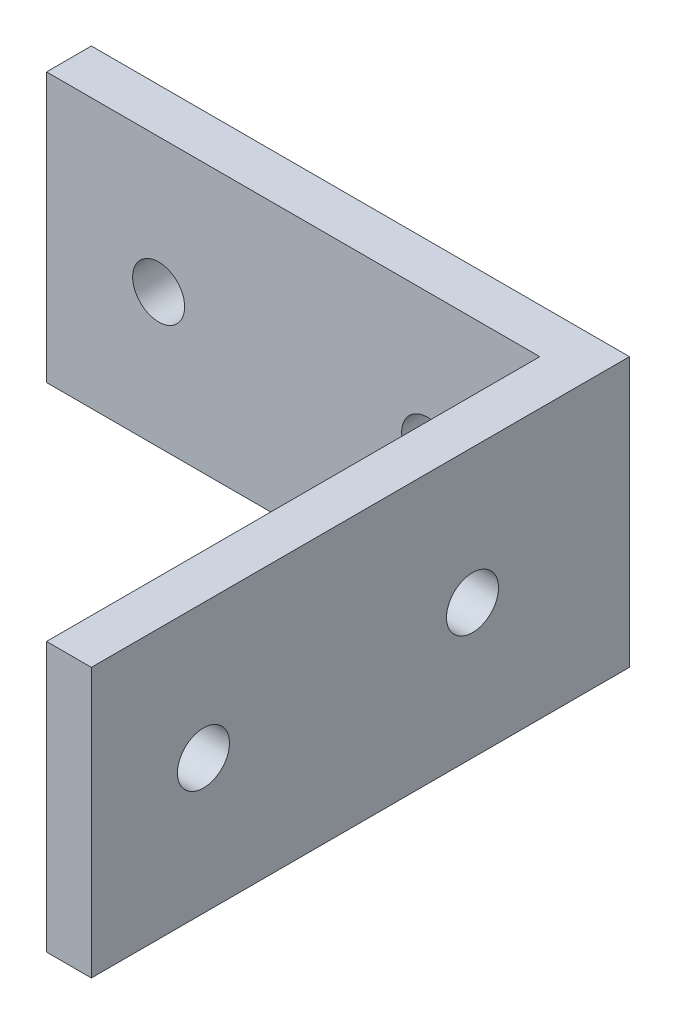
ISO-10303-21;
HEADER;
FILE_DESCRIPTION(('STEP AP214'),'2;1');
FILE_NAME('part.step','',(''),(''),'','','');
FILE_SCHEMA(('AUTOMOTIVE_DESIGN { 1 0 10303 214 1 1 1 1 }'));
ENDSEC;
DATA;
#1=APPLICATION_CONTEXT('core data for automotive mechanical design processes');
#2=APPLICATION_PROTOCOL_DEFINITION('international standard','automotive_design',2000,#1);
#3=PRODUCT_CONTEXT('',#1,'mechanical');
#4=PRODUCT('Part','Part','',(#3));
#5=PRODUCT_RELATED_PRODUCT_CATEGORY('part','',(#4));
#6=PRODUCT_DEFINITION_FORMATION('','',#4);
#7=PRODUCT_DEFINITION_CONTEXT('part definition',#1,'design');
#8=PRODUCT_DEFINITION('design','',#6,#7);
#9=PRODUCT_DEFINITION_SHAPE('','',#8);
#10=(LENGTH_UNIT() NAMED_UNIT(*) SI_UNIT(.MILLI.,.METRE.));
#11=(NAMED_UNIT(*) PLANE_ANGLE_UNIT() SI_UNIT($,.RADIAN.));
#12=(NAMED_UNIT(*) SI_UNIT($,.STERADIAN.) SOLID_ANGLE_UNIT());
#13=UNCERTAINTY_MEASURE_WITH_UNIT(LENGTH_MEASURE(1.E-05),#10,'distance_accuracy_value','');
#14=(GEOMETRIC_REPRESENTATION_CONTEXT(3) GLOBAL_UNCERTAINTY_ASSIGNED_CONTEXT((#13)) GLOBAL_UNIT_ASSIGNED_CONTEXT((#10,
#11,#12)) REPRESENTATION_CONTEXT('',''));
#15=CARTESIAN_POINT('',(0.,0.,0.));
#16=DIRECTION('',(0.,0.,1.));
#17=DIRECTION('',(1.,0.,0.));
#18=AXIS2_PLACEMENT_3D('',#15,#16,#17);
#19=CARTESIAN_POINT('',(-38.1,38.1,-38.1));
#20=DIRECTION('',(1.,0.,0.));
#21=DIRECTION('',(0.,0.,-1.));
#22=AXIS2_PLACEMENT_3D('',#19,#20,#21);
#23=PLANE('',#22);
#24=DIRECTION('',(0.,1.,0.));
#25=VECTOR('',#24,1.);
#26=CARTESIAN_POINT('',(-38.1,0.,-31.75));
#27=LINE('',#26,#25);
#28=CARTESIAN_POINT('',(-38.1,0.,-31.75));
#29=VERTEX_POINT('',#28);
#30=CARTESIAN_POINT('',(-38.1,38.1,-31.75));
#31=VERTEX_POINT('',#30);
#32=EDGE_CURVE('E56',#29,#31,#27,.T.);
#33=ORIENTED_EDGE('',*,*,#32,.T.);
#34=DIRECTION('',(0.,0.,1.));
#35=VECTOR('',#34,1.);
#36=CARTESIAN_POINT('',(-38.1,38.1,-38.1));
#37=LINE('',#36,#35);
#38=CARTESIAN_POINT('',(-38.1,38.1,-38.1));
#39=VERTEX_POINT('',#38);
#40=EDGE_CURVE('E140',#39,#31,#37,.T.);
#41=ORIENTED_EDGE('',*,*,#40,.F.);
#42=DIRECTION('',(0.,-1.,0.));
#43=VECTOR('',#42,1.);
#44=CARTESIAN_POINT('',(-38.1,38.1,-38.1));
#45=LINE('',#44,#43);
#46=CARTESIAN_POINT('',(-38.1,0.,-38.1));
#47=VERTEX_POINT('',#46);
#48=EDGE_CURVE('E49',#39,#47,#45,.T.);
#49=ORIENTED_EDGE('',*,*,#48,.T.);
#50=DIRECTION('',(0.,0.,1.));
#51=VECTOR('',#50,1.);
#52=CARTESIAN_POINT('',(-38.1,0.,-38.1));
#53=LINE('',#52,#51);
#54=EDGE_CURVE('E122',#47,#29,#53,.T.);
#55=ORIENTED_EDGE('',*,*,#54,.T.);
#56=EDGE_LOOP('',(#33,#41,#49,#55));
#57=FACE_BOUND('',#56,.T.);
#58=ADVANCED_FACE('F40',(#57),#23,.F.);
#59=CARTESIAN_POINT('',(-38.1,38.1,38.1));
#60=DIRECTION('',(0.,0.,-1.));
#61=DIRECTION('',(-1.,0.,0.));
#62=AXIS2_PLACEMENT_3D('',#59,#60,#61);
#63=PLANE('',#62);
#64=DIRECTION('',(0.,1.,0.));
#65=VECTOR('',#64,1.);
#66=CARTESIAN_POINT('',(31.75,0.,38.1));
#67=LINE('',#66,#65);
#68=CARTESIAN_POINT('',(31.75,0.,38.1));
#69=VERTEX_POINT('',#68);
#70=CARTESIAN_POINT('',(31.75,38.1,38.1));
#71=VERTEX_POINT('',#70);
#72=EDGE_CURVE('E107',#69,#71,#67,.T.);
#73=ORIENTED_EDGE('',*,*,#72,.F.);
#74=DIRECTION('',(1.,0.,0.));
#75=VECTOR('',#74,1.);
#76=CARTESIAN_POINT('',(-38.1,0.,38.1));
#77=LINE('',#76,#75);
#78=CARTESIAN_POINT('',(38.1,0.,38.1));
#79=VERTEX_POINT('',#78);
#80=EDGE_CURVE('E83',#69,#79,#77,.T.);
#81=ORIENTED_EDGE('',*,*,#80,.T.);
#82=DIRECTION('',(0.,-1.,0.));
#83=VECTOR('',#82,1.);
#84=CARTESIAN_POINT('',(38.1,38.1,38.1));
#85=LINE('',#84,#83);
#86=CARTESIAN_POINT('',(38.1,38.1,38.1));
#87=VERTEX_POINT('',#86);
#88=EDGE_CURVE('E132',#87,#79,#85,.T.);
#89=ORIENTED_EDGE('',*,*,#88,.F.);
#90=DIRECTION('',(1.,0.,0.));
#91=VECTOR('',#90,1.);
#92=CARTESIAN_POINT('',(-38.1,38.1,38.1));
#93=LINE('',#92,#91);
#94=EDGE_CURVE('E65',#71,#87,#93,.T.);
#95=ORIENTED_EDGE('',*,*,#94,.F.);
#96=EDGE_LOOP('',(#73,#81,#89,#95));
#97=FACE_BOUND('',#96,.T.);
#98=ADVANCED_FACE('F113',(#97),#63,.F.);
#99=CARTESIAN_POINT('',(0.,38.1,0.));
#100=DIRECTION('',(0.,1.,0.));
#101=DIRECTION('',(0.,0.,1.));
#102=AXIS2_PLACEMENT_3D('',#99,#100,#101);
#103=PLANE('',#102);
#104=DIRECTION('',(1.,0.,0.));
#105=VECTOR('',#104,1.);
#106=CARTESIAN_POINT('',(-38.1,38.1,-31.75));
#107=LINE('',#106,#105);
#108=CARTESIAN_POINT('',(31.75,38.1,-31.75));
#109=VERTEX_POINT('',#108);
#110=EDGE_CURVE('E145',#31,#109,#107,.T.);
#111=ORIENTED_EDGE('',*,*,#110,.T.);
#112=DIRECTION('',(0.,0.,1.));
#113=VECTOR('',#112,1.);
#114=CARTESIAN_POINT('',(31.75,38.1,-31.75));
#115=LINE('',#114,#113);
#116=EDGE_CURVE('E142',#109,#71,#115,.T.);
#117=ORIENTED_EDGE('',*,*,#116,.T.);
#118=ORIENTED_EDGE('',*,*,#94,.T.);
#119=DIRECTION('',(0.,0.,-1.));
#120=VECTOR('',#119,1.);
#121=CARTESIAN_POINT('',(38.1,38.1,-38.1));
#122=LINE('',#121,#120);
#123=CARTESIAN_POINT('',(38.1,38.1,-38.1));
#124=VERTEX_POINT('',#123);
#125=EDGE_CURVE('E121',#87,#124,#122,.T.);
#126=ORIENTED_EDGE('',*,*,#125,.T.);
#127=DIRECTION('',(-1.,0.,0.));
#128=VECTOR('',#127,1.);
#129=CARTESIAN_POINT('',(-38.1,38.1,-38.1));
#130=LINE('',#129,#128);
#131=EDGE_CURVE('E88',#124,#39,#130,.T.);
#132=ORIENTED_EDGE('',*,*,#131,.T.);
#133=ORIENTED_EDGE('',*,*,#40,.T.);
#134=EDGE_LOOP('',(#111,#117,#118,#126,#132,#133));
#135=FACE_BOUND('',#134,.T.);
#136=ADVANCED_FACE('F170',(#135),#103,.T.);
#137=CARTESIAN_POINT('',(0.,0.,0.));
#138=DIRECTION('',(0.,1.,0.));
#139=DIRECTION('',(0.,0.,1.));
#140=AXIS2_PLACEMENT_3D('',#137,#138,#139);
#141=PLANE('',#140);
#142=DIRECTION('',(0.,0.,1.));
#143=VECTOR('',#142,1.);
#144=CARTESIAN_POINT('',(31.75,0.,-31.75));
#145=LINE('',#144,#143);
#146=CARTESIAN_POINT('',(31.75,0.,-31.75));
#147=VERTEX_POINT('',#146);
#148=EDGE_CURVE('E104',#147,#69,#145,.T.);
#149=ORIENTED_EDGE('',*,*,#148,.F.);
#150=DIRECTION('',(1.,0.,0.));
#151=VECTOR('',#150,1.);
#152=CARTESIAN_POINT('',(-38.1,0.,-31.75));
#153=LINE('',#152,#151);
#154=EDGE_CURVE('E111',#29,#147,#153,.T.);
#155=ORIENTED_EDGE('',*,*,#154,.F.);
#156=ORIENTED_EDGE('',*,*,#54,.F.);
#157=DIRECTION('',(-1.,0.,0.));
#158=VECTOR('',#157,1.);
#159=CARTESIAN_POINT('',(-38.1,0.,-38.1));
#160=LINE('',#159,#158);
#161=CARTESIAN_POINT('',(38.1,0.,-38.1));
#162=VERTEX_POINT('',#161);
#163=EDGE_CURVE('E128',#162,#47,#160,.T.);
#164=ORIENTED_EDGE('',*,*,#163,.F.);
#165=DIRECTION('',(0.,0.,-1.));
#166=VECTOR('',#165,1.);
#167=CARTESIAN_POINT('',(38.1,0.,-38.1));
#168=LINE('',#167,#166);
#169=EDGE_CURVE('E115',#79,#162,#168,.T.);
#170=ORIENTED_EDGE('',*,*,#169,.F.);
#171=ORIENTED_EDGE('',*,*,#80,.F.);
#172=EDGE_LOOP('',(#149,#155,#156,#164,#170,#171));
#173=FACE_BOUND('',#172,.T.);
#174=ADVANCED_FACE('F118',(#173),#141,.F.);
#175=CARTESIAN_POINT('',(38.1,38.1,-38.1));
#176=DIRECTION('',(-1.,0.,0.));
#177=DIRECTION('',(0.,0.,1.));
#178=AXIS2_PLACEMENT_3D('',#175,#176,#177);
#179=PLANE('',#178);
#180=CARTESIAN_POINT('',(38.1,19.05,-15.875));
#181=DIRECTION('',(-1.,0.,0.));
#182=DIRECTION('',(0.,0.,1.));
#183=AXIS2_PLACEMENT_3D('',#180,#181,#182);
#184=CIRCLE('',#183,3.683);
#185=CARTESIAN_POINT('',(38.1,19.05,-12.192));
#186=VERTEX_POINT('',#185);
#187=EDGE_CURVE('E218',#186,#186,#184,.T.);
#188=ORIENTED_EDGE('',*,*,#187,.T.);
#189=EDGE_LOOP('',(#188));
#190=FACE_BOUND('',#189,.T.);
#191=CARTESIAN_POINT('',(38.1,19.05,22.225));
#192=DIRECTION('',(-1.,0.,0.));
#193=DIRECTION('',(0.,0.,1.));
#194=AXIS2_PLACEMENT_3D('',#191,#192,#193);
#195=CIRCLE('',#194,3.683);
#196=CARTESIAN_POINT('',(38.1,19.05,25.908));
#197=VERTEX_POINT('',#196);
#198=EDGE_CURVE('E223',#197,#197,#195,.T.);
#199=ORIENTED_EDGE('',*,*,#198,.T.);
#200=EDGE_LOOP('',(#199));
#201=FACE_BOUND('',#200,.T.);
#202=ORIENTED_EDGE('',*,*,#169,.T.);
#203=DIRECTION('',(0.,-1.,0.));
#204=VECTOR('',#203,1.);
#205=CARTESIAN_POINT('',(38.1,38.1,-38.1));
#206=LINE('',#205,#204);
#207=EDGE_CURVE('E12',#124,#162,#206,.T.);
#208=ORIENTED_EDGE('',*,*,#207,.F.);
#209=ORIENTED_EDGE('',*,*,#125,.F.);
#210=ORIENTED_EDGE('',*,*,#88,.T.);
#211=EDGE_LOOP('',(#202,#208,#209,#210));
#212=FACE_BOUND('',#211,.T.);
#213=ADVANCED_FACE('F42',(#190,#201,#212),#179,.F.);
#214=CARTESIAN_POINT('',(-38.1,38.1,-38.1));
#215=DIRECTION('',(0.,0.,1.));
#216=DIRECTION('',(1.,0.,0.));
#217=AXIS2_PLACEMENT_3D('',#214,#215,#216);
#218=PLANE('',#217);
#219=CARTESIAN_POINT('',(-22.225,19.05,-38.1));
#220=DIRECTION('',(0.,0.,1.));
#221=DIRECTION('',(1.,0.,0.));
#222=AXIS2_PLACEMENT_3D('',#219,#220,#221);
#223=CIRCLE('',#222,3.683);
#224=CARTESIAN_POINT('',(-18.542,19.05,-38.1));
#225=VERTEX_POINT('',#224);
#226=EDGE_CURVE('E148',#225,#225,#223,.T.);
#227=ORIENTED_EDGE('',*,*,#226,.T.);
#228=EDGE_LOOP('',(#227));
#229=FACE_BOUND('',#228,.T.);
#230=CARTESIAN_POINT('',(15.875,19.05,-38.1));
#231=DIRECTION('',(0.,0.,1.));
#232=DIRECTION('',(1.,0.,0.));
#233=AXIS2_PLACEMENT_3D('',#230,#231,#232);
#234=CIRCLE('',#233,3.683);
#235=CARTESIAN_POINT('',(19.558,19.05,-38.1));
#236=VERTEX_POINT('',#235);
#237=EDGE_CURVE('E206',#236,#236,#234,.T.);
#238=ORIENTED_EDGE('',*,*,#237,.T.);
#239=EDGE_LOOP('',(#238));
#240=FACE_BOUND('',#239,.T.);
#241=ORIENTED_EDGE('',*,*,#163,.T.);
#242=ORIENTED_EDGE('',*,*,#48,.F.);
#243=ORIENTED_EDGE('',*,*,#131,.F.);
#244=ORIENTED_EDGE('',*,*,#207,.T.);
#245=EDGE_LOOP('',(#241,#242,#243,#244));
#246=FACE_BOUND('',#245,.T.);
#247=ADVANCED_FACE('F166',(#229,#240,#246),#218,.F.);
#248=CARTESIAN_POINT('',(31.75,0.,-31.75));
#249=DIRECTION('',(-1.,0.,0.));
#250=DIRECTION('',(0.,0.,1.));
#251=AXIS2_PLACEMENT_3D('',#248,#249,#250);
#252=PLANE('',#251);
#253=CARTESIAN_POINT('',(31.75,19.05,-15.875));
#254=DIRECTION('',(-1.,0.,0.));
#255=DIRECTION('',(0.,0.,1.));
#256=AXIS2_PLACEMENT_3D('',#253,#254,#255);
#257=CIRCLE('',#256,3.683);
#258=CARTESIAN_POINT('',(31.75,19.05,-12.192));
#259=VERTEX_POINT('',#258);
#260=EDGE_CURVE('E227',#259,#259,#257,.T.);
#261=ORIENTED_EDGE('',*,*,#260,.F.);
#262=EDGE_LOOP('',(#261));
#263=FACE_BOUND('',#262,.T.);
#264=CARTESIAN_POINT('',(31.75,19.05,22.225));
#265=DIRECTION('',(-1.,0.,0.));
#266=DIRECTION('',(0.,0.,1.));
#267=AXIS2_PLACEMENT_3D('',#264,#265,#266);
#268=CIRCLE('',#267,3.683);
#269=CARTESIAN_POINT('',(31.75,19.05,25.908));
#270=VERTEX_POINT('',#269);
#271=EDGE_CURVE('E228',#270,#270,#268,.T.);
#272=ORIENTED_EDGE('',*,*,#271,.F.);
#273=EDGE_LOOP('',(#272));
#274=FACE_BOUND('',#273,.T.);
#275=ORIENTED_EDGE('',*,*,#116,.F.);
#276=DIRECTION('',(0.,1.,0.));
#277=VECTOR('',#276,1.);
#278=CARTESIAN_POINT('',(31.75,0.,-31.75));
#279=LINE('',#278,#277);
#280=EDGE_CURVE('E108',#147,#109,#279,.T.);
#281=ORIENTED_EDGE('',*,*,#280,.F.);
#282=ORIENTED_EDGE('',*,*,#148,.T.);
#283=ORIENTED_EDGE('',*,*,#72,.T.);
#284=EDGE_LOOP('',(#275,#281,#282,#283));
#285=FACE_BOUND('',#284,.T.);
#286=ADVANCED_FACE('F106',(#263,#274,#285),#252,.T.);
#287=CARTESIAN_POINT('',(-38.1,0.,-31.75));
#288=DIRECTION('',(0.,0.,1.));
#289=DIRECTION('',(1.,0.,0.));
#290=AXIS2_PLACEMENT_3D('',#287,#288,#289);
#291=PLANE('',#290);
#292=CARTESIAN_POINT('',(-22.225,19.05,-31.75));
#293=DIRECTION('',(0.,0.,1.));
#294=DIRECTION('',(1.,0.,0.));
#295=AXIS2_PLACEMENT_3D('',#292,#293,#294);
#296=CIRCLE('',#295,3.683);
#297=CARTESIAN_POINT('',(-18.542,19.05,-31.75));
#298=VERTEX_POINT('',#297);
#299=EDGE_CURVE('E209',#298,#298,#296,.T.);
#300=ORIENTED_EDGE('',*,*,#299,.F.);
#301=EDGE_LOOP('',(#300));
#302=FACE_BOUND('',#301,.T.);
#303=CARTESIAN_POINT('',(15.875,19.05,-31.75));
#304=DIRECTION('',(0.,0.,1.));
#305=DIRECTION('',(1.,0.,0.));
#306=AXIS2_PLACEMENT_3D('',#303,#304,#305);
#307=CIRCLE('',#306,3.683);
#308=CARTESIAN_POINT('',(19.558,19.05,-31.75));
#309=VERTEX_POINT('',#308);
#310=EDGE_CURVE('E213',#309,#309,#307,.T.);
#311=ORIENTED_EDGE('',*,*,#310,.F.);
#312=EDGE_LOOP('',(#311));
#313=FACE_BOUND('',#312,.T.);
#314=ORIENTED_EDGE('',*,*,#110,.F.);
#315=ORIENTED_EDGE('',*,*,#32,.F.);
#316=ORIENTED_EDGE('',*,*,#154,.T.);
#317=ORIENTED_EDGE('',*,*,#280,.T.);
#318=EDGE_LOOP('',(#314,#315,#316,#317));
#319=FACE_BOUND('',#318,.T.);
#320=ADVANCED_FACE('F171',(#302,#313,#319),#291,.T.);
#321=CARTESIAN_POINT('',(15.875,19.05,-69.85));
#322=DIRECTION('',(0.,0.,1.));
#323=DIRECTION('',(1.,0.,0.));
#324=AXIS2_PLACEMENT_3D('',#321,#322,#323);
#325=CYLINDRICAL_SURFACE('',#324,3.683);
#326=CARTESIAN_POINT('',(19.558,19.05,-31.75));
#327=CARTESIAN_POINT('',(19.558,19.05,-31.8161458333334));
#328=CARTESIAN_POINT('',(19.558,19.05,-31.8822916666667));
#329=CARTESIAN_POINT('',(19.558,19.05,-32.0145833333334));
#330=CARTESIAN_POINT('',(19.558,19.05,-32.0807291666667));
#331=CARTESIAN_POINT('',(19.558,19.05,-32.2130208333334));
#332=CARTESIAN_POINT('',(19.558,19.05,-32.2791666666667));
#333=CARTESIAN_POINT('',(19.558,19.05,-32.4114583333333));
#334=CARTESIAN_POINT('',(19.558,19.05,-32.4776041666667));
#335=CARTESIAN_POINT('',(19.558,19.05,-32.6098958333334));
#336=CARTESIAN_POINT('',(19.558,19.05,-32.6760416666667));
#337=CARTESIAN_POINT('',(19.558,19.05,-32.8083333333334));
#338=CARTESIAN_POINT('',(19.558,19.05,-32.8744791666667));
#339=CARTESIAN_POINT('',(19.558,19.05,-33.0067708333333));
#340=CARTESIAN_POINT('',(19.558,19.05,-33.0729166666667));
#341=CARTESIAN_POINT('',(19.558,19.05,-33.2052083333334));
#342=CARTESIAN_POINT('',(19.558,19.05,-33.2713541666667));
#343=CARTESIAN_POINT('',(19.558,19.05,-33.4036458333334));
#344=CARTESIAN_POINT('',(19.558,19.05,-33.4697916666667));
#345=CARTESIAN_POINT('',(19.558,19.05,-33.6020833333334));
#346=CARTESIAN_POINT('',(19.558,19.05,-33.6682291666667));
#347=CARTESIAN_POINT('',(19.558,19.05,-33.8005208333334));
#348=CARTESIAN_POINT('',(19.558,19.05,-33.8666666666667));
#349=CARTESIAN_POINT('',(19.558,19.05,-33.9989583333334));
#350=CARTESIAN_POINT('',(19.558,19.05,-34.0651041666667));
#351=CARTESIAN_POINT('',(19.558,19.05,-34.1973958333334));
#352=CARTESIAN_POINT('',(19.558,19.05,-34.2635416666667));
#353=CARTESIAN_POINT('',(19.558,19.05,-34.3958333333334));
#354=CARTESIAN_POINT('',(19.558,19.05,-34.4619791666667));
#355=CARTESIAN_POINT('',(19.558,19.05,-34.5942708333333));
#356=CARTESIAN_POINT('',(19.558,19.05,-34.6604166666667));
#357=CARTESIAN_POINT('',(19.558,19.05,-34.7927083333334));
#358=CARTESIAN_POINT('',(19.558,19.05,-34.8588541666667));
#359=CARTESIAN_POINT('',(19.558,19.05,-34.9911458333334));
#360=CARTESIAN_POINT('',(19.558,19.05,-35.0572916666667));
#361=CARTESIAN_POINT('',(19.558,19.05,-35.1895833333334));
#362=CARTESIAN_POINT('',(19.558,19.05,-35.2557291666667));
#363=CARTESIAN_POINT('',(19.558,19.05,-35.3880208333333));
#364=CARTESIAN_POINT('',(19.558,19.05,-35.4541666666667));
#365=CARTESIAN_POINT('',(19.558,19.05,-35.5864583333333));
#366=CARTESIAN_POINT('',(19.558,19.05,-35.6526041666667));
#367=CARTESIAN_POINT('',(19.558,19.05,-35.7848958333334));
#368=CARTESIAN_POINT('',(19.558,19.05,-35.8510416666667));
#369=CARTESIAN_POINT('',(19.558,19.05,-35.9833333333334));
#370=CARTESIAN_POINT('',(19.558,19.05,-36.0494791666667));
#371=CARTESIAN_POINT('',(19.558,19.05,-36.1817708333333));
#372=CARTESIAN_POINT('',(19.558,19.05,-36.2479166666667));
#373=CARTESIAN_POINT('',(19.558,19.05,-36.3802083333333));
#374=CARTESIAN_POINT('',(19.558,19.05,-36.4463541666667));
#375=CARTESIAN_POINT('',(19.558,19.05,-36.5786458333334));
#376=CARTESIAN_POINT('',(19.558,19.05,-36.6447916666667));
#377=CARTESIAN_POINT('',(19.558,19.05,-36.7770833333334));
#378=CARTESIAN_POINT('',(19.558,19.05,-36.8432291666667));
#379=CARTESIAN_POINT('',(19.558,19.05,-36.9755208333333));
#380=CARTESIAN_POINT('',(19.558,19.05,-37.0416666666667));
#381=CARTESIAN_POINT('',(19.558,19.05,-37.1739583333334));
#382=CARTESIAN_POINT('',(19.558,19.05,-37.2401041666667));
#383=CARTESIAN_POINT('',(19.558,19.05,-37.3723958333333));
#384=CARTESIAN_POINT('',(19.558,19.05,-37.4385416666667));
#385=CARTESIAN_POINT('',(19.558,19.05,-37.5708333333334));
#386=CARTESIAN_POINT('',(19.558,19.05,-37.6369791666667));
#387=CARTESIAN_POINT('',(19.558,19.05,-37.7692708333333));
#388=CARTESIAN_POINT('',(19.558,19.05,-37.8354166666667));
#389=CARTESIAN_POINT('',(19.558,19.05,-37.9677083333333));
#390=CARTESIAN_POINT('',(19.558,19.05,-38.0338541666667));
#391=CARTESIAN_POINT('',(19.558,19.05,-38.1));
#392=B_SPLINE_CURVE_WITH_KNOTS('',3,(#326,#327,#328,#329,#330,#331,#332,#333,#334,#335,#336,
#337,#338,#339,#340,#341,#342,#343,#344,#345,#346,#347,#348,#349,#350,#351,#352,#353,#354,#355,
#356,#357,#358,#359,#360,#361,#362,#363,#364,#365,#366,#367,#368,#369,#370,#371,#372,#373,#374,
#375,#376,#377,#378,#379,#380,#381,#382,#383,#384,#385,#386,#387,#388,#389,#390,#391),
.UNSPECIFIED.,.F.,.F.,(4,2,2,2,2,2,2,2,2,2,2,2,2,2,2,2,2,2,2,2,2,2,2,2,2,2,2,2,2,2,2,2,4),(0.,
0.198437500000002,0.396874999999998,0.5953125,0.793749999999996,0.992187499999998,1.190625,
1.3890625,1.5875,1.7859375,1.984375,2.1828125,2.38125,2.5796875,2.778125,2.97656249999999,3.175,
3.3734375,3.571875,3.7703125,3.96874999999999,4.1671875,4.365625,4.56406249999999,4.7625,
4.9609375,5.15937499999999,5.3578125,5.55625,5.75468749999999,5.953125,6.15156249999999,
6.34999999999999),.UNSPECIFIED.);
#393=EDGE_CURVE('BSEAM173',#309,#236,#392,.T.);
#394=ORIENTED_EDGE('',*,*,#310,.T.);
#395=ORIENTED_EDGE('',*,*,#237,.F.);
#396=ORIENTED_EDGE('',*,*,#393,.T.);
#397=ORIENTED_EDGE('',*,*,#393,.F.);
#398=EDGE_LOOP('',(#394,#396,#395,#397));
#399=FACE_BOUND('',#398,.T.);
#400=ADVANCED_FACE('F173',(#399),#325,.F.);
#401=CARTESIAN_POINT('',(-22.225,19.05,-69.85));
#402=DIRECTION('',(0.,0.,1.));
#403=DIRECTION('',(1.,0.,0.));
#404=AXIS2_PLACEMENT_3D('',#401,#402,#403);
#405=CYLINDRICAL_SURFACE('',#404,3.683);
#406=CARTESIAN_POINT('',(-18.542,19.05,-31.75));
#407=CARTESIAN_POINT('',(-18.542,19.05,-31.8161458333334));
#408=CARTESIAN_POINT('',(-18.542,19.05,-31.8822916666667));
#409=CARTESIAN_POINT('',(-18.542,19.05,-32.0145833333334));
#410=CARTESIAN_POINT('',(-18.542,19.05,-32.0807291666667));
#411=CARTESIAN_POINT('',(-18.542,19.05,-32.2130208333334));
#412=CARTESIAN_POINT('',(-18.542,19.05,-32.2791666666667));
#413=CARTESIAN_POINT('',(-18.542,19.05,-32.4114583333333));
#414=CARTESIAN_POINT('',(-18.542,19.05,-32.4776041666667));
#415=CARTESIAN_POINT('',(-18.542,19.05,-32.6098958333334));
#416=CARTESIAN_POINT('',(-18.542,19.05,-32.6760416666667));
#417=CARTESIAN_POINT('',(-18.542,19.05,-32.8083333333334));
#418=CARTESIAN_POINT('',(-18.542,19.05,-32.8744791666667));
#419=CARTESIAN_POINT('',(-18.542,19.05,-33.0067708333333));
#420=CARTESIAN_POINT('',(-18.542,19.05,-33.0729166666667));
#421=CARTESIAN_POINT('',(-18.542,19.05,-33.2052083333334));
#422=CARTESIAN_POINT('',(-18.542,19.05,-33.2713541666667));
#423=CARTESIAN_POINT('',(-18.542,19.05,-33.4036458333334));
#424=CARTESIAN_POINT('',(-18.542,19.05,-33.4697916666667));
#425=CARTESIAN_POINT('',(-18.542,19.05,-33.6020833333334));
#426=CARTESIAN_POINT('',(-18.542,19.05,-33.6682291666667));
#427=CARTESIAN_POINT('',(-18.542,19.05,-33.8005208333334));
#428=CARTESIAN_POINT('',(-18.542,19.05,-33.8666666666667));
#429=CARTESIAN_POINT('',(-18.542,19.05,-33.9989583333334));
#430=CARTESIAN_POINT('',(-18.542,19.05,-34.0651041666667));
#431=CARTESIAN_POINT('',(-18.542,19.05,-34.1973958333334));
#432=CARTESIAN_POINT('',(-18.542,19.05,-34.2635416666667));
#433=CARTESIAN_POINT('',(-18.542,19.05,-34.3958333333334));
#434=CARTESIAN_POINT('',(-18.542,19.05,-34.4619791666667));
#435=CARTESIAN_POINT('',(-18.542,19.05,-34.5942708333333));
#436=CARTESIAN_POINT('',(-18.542,19.05,-34.6604166666667));
#437=CARTESIAN_POINT('',(-18.542,19.05,-34.7927083333334));
#438=CARTESIAN_POINT('',(-18.542,19.05,-34.8588541666667));
#439=CARTESIAN_POINT('',(-18.542,19.05,-34.9911458333334));
#440=CARTESIAN_POINT('',(-18.542,19.05,-35.0572916666667));
#441=CARTESIAN_POINT('',(-18.542,19.05,-35.1895833333334));
#442=CARTESIAN_POINT('',(-18.542,19.05,-35.2557291666667));
#443=CARTESIAN_POINT('',(-18.542,19.05,-35.3880208333333));
#444=CARTESIAN_POINT('',(-18.542,19.05,-35.4541666666667));
#445=CARTESIAN_POINT('',(-18.542,19.05,-35.5864583333333));
#446=CARTESIAN_POINT('',(-18.542,19.05,-35.6526041666667));
#447=CARTESIAN_POINT('',(-18.542,19.05,-35.7848958333334));
#448=CARTESIAN_POINT('',(-18.542,19.05,-35.8510416666667));
#449=CARTESIAN_POINT('',(-18.542,19.05,-35.9833333333334));
#450=CARTESIAN_POINT('',(-18.542,19.05,-36.0494791666667));
#451=CARTESIAN_POINT('',(-18.542,19.05,-36.1817708333333));
#452=CARTESIAN_POINT('',(-18.542,19.05,-36.2479166666667));
#453=CARTESIAN_POINT('',(-18.542,19.05,-36.3802083333333));
#454=CARTESIAN_POINT('',(-18.542,19.05,-36.4463541666667));
#455=CARTESIAN_POINT('',(-18.542,19.05,-36.5786458333334));
#456=CARTESIAN_POINT('',(-18.542,19.05,-36.6447916666667));
#457=CARTESIAN_POINT('',(-18.542,19.05,-36.7770833333334));
#458=CARTESIAN_POINT('',(-18.542,19.05,-36.8432291666667));
#459=CARTESIAN_POINT('',(-18.542,19.05,-36.9755208333333));
#460=CARTESIAN_POINT('',(-18.542,19.05,-37.0416666666667));
#461=CARTESIAN_POINT('',(-18.542,19.05,-37.1739583333334));
#462=CARTESIAN_POINT('',(-18.542,19.05,-37.2401041666667));
#463=CARTESIAN_POINT('',(-18.542,19.05,-37.3723958333333));
#464=CARTESIAN_POINT('',(-18.542,19.05,-37.4385416666667));
#465=CARTESIAN_POINT('',(-18.542,19.05,-37.5708333333334));
#466=CARTESIAN_POINT('',(-18.542,19.05,-37.6369791666667));
#467=CARTESIAN_POINT('',(-18.542,19.05,-37.7692708333333));
#468=CARTESIAN_POINT('',(-18.542,19.05,-37.8354166666667));
#469=CARTESIAN_POINT('',(-18.542,19.05,-37.9677083333333));
#470=CARTESIAN_POINT('',(-18.542,19.05,-38.0338541666667));
#471=CARTESIAN_POINT('',(-18.542,19.05,-38.1));
#472=B_SPLINE_CURVE_WITH_KNOTS('',3,(#406,#407,#408,#409,#410,#411,#412,#413,#414,#415,#416,
#417,#418,#419,#420,#421,#422,#423,#424,#425,#426,#427,#428,#429,#430,#431,#432,#433,#434,#435,
#436,#437,#438,#439,#440,#441,#442,#443,#444,#445,#446,#447,#448,#449,#450,#451,#452,#453,#454,
#455,#456,#457,#458,#459,#460,#461,#462,#463,#464,#465,#466,#467,#468,#469,#470,#471),
.UNSPECIFIED.,.F.,.F.,(4,2,2,2,2,2,2,2,2,2,2,2,2,2,2,2,2,2,2,2,2,2,2,2,2,2,2,2,2,2,2,2,4),(0.,
0.198437500000002,0.396874999999998,0.5953125,0.793749999999996,0.992187499999998,1.190625,
1.3890625,1.5875,1.7859375,1.984375,2.1828125,2.38125,2.5796875,2.778125,2.97656249999999,3.175,
3.3734375,3.571875,3.7703125,3.96874999999999,4.1671875,4.365625,4.56406249999999,4.7625,
4.9609375,5.15937499999999,5.3578125,5.55625,5.75468749999999,5.953125,6.15156249999999,
6.34999999999999),.UNSPECIFIED.);
#473=EDGE_CURVE('BSEAM180',#298,#225,#472,.T.);
#474=ORIENTED_EDGE('',*,*,#299,.T.);
#475=ORIENTED_EDGE('',*,*,#226,.F.);
#476=ORIENTED_EDGE('',*,*,#473,.T.);
#477=ORIENTED_EDGE('',*,*,#473,.F.);
#478=EDGE_LOOP('',(#474,#476,#475,#477));
#479=FACE_BOUND('',#478,.T.);
#480=ADVANCED_FACE('F180',(#479),#405,.F.);
#481=CARTESIAN_POINT('',(69.85,19.05,22.225));
#482=DIRECTION('',(-1.,0.,0.));
#483=DIRECTION('',(0.,0.,1.));
#484=AXIS2_PLACEMENT_3D('',#481,#482,#483);
#485=CYLINDRICAL_SURFACE('',#484,3.683);
#486=CARTESIAN_POINT('',(31.75,19.05,25.908));
#487=CARTESIAN_POINT('',(31.8161458333333,19.05,25.908));
#488=CARTESIAN_POINT('',(31.8822916666667,19.05,25.908));
#489=CARTESIAN_POINT('',(32.0145833333333,19.05,25.908));
#490=CARTESIAN_POINT('',(32.0807291666667,19.05,25.908));
#491=CARTESIAN_POINT('',(32.2130208333333,19.05,25.908));
#492=CARTESIAN_POINT('',(32.2791666666667,19.05,25.908));
#493=CARTESIAN_POINT('',(32.4114583333333,19.05,25.908));
#494=CARTESIAN_POINT('',(32.4776041666667,19.05,25.908));
#495=CARTESIAN_POINT('',(32.6098958333333,19.05,25.908));
#496=CARTESIAN_POINT('',(32.6760416666667,19.05,25.908));
#497=CARTESIAN_POINT('',(32.8083333333333,19.05,25.908));
#498=CARTESIAN_POINT('',(32.8744791666667,19.05,25.908));
#499=CARTESIAN_POINT('',(33.0067708333333,19.05,25.908));
#500=CARTESIAN_POINT('',(33.0729166666667,19.05,25.908));
#501=CARTESIAN_POINT('',(33.2052083333333,19.05,25.908));
#502=CARTESIAN_POINT('',(33.2713541666667,19.05,25.908));
#503=CARTESIAN_POINT('',(33.4036458333333,19.05,25.908));
#504=CARTESIAN_POINT('',(33.4697916666667,19.05,25.908));
#505=CARTESIAN_POINT('',(33.6020833333333,19.05,25.908));
#506=CARTESIAN_POINT('',(33.6682291666667,19.05,25.908));
#507=CARTESIAN_POINT('',(33.8005208333333,19.05,25.908));
#508=CARTESIAN_POINT('',(33.8666666666667,19.05,25.908));
#509=CARTESIAN_POINT('',(33.9989583333333,19.05,25.908));
#510=CARTESIAN_POINT('',(34.0651041666667,19.05,25.908));
#511=CARTESIAN_POINT('',(34.1973958333333,19.05,25.908));
#512=CARTESIAN_POINT('',(34.2635416666667,19.05,25.908));
#513=CARTESIAN_POINT('',(34.3958333333333,19.05,25.908));
#514=CARTESIAN_POINT('',(34.4619791666667,19.05,25.908));
#515=CARTESIAN_POINT('',(34.5942708333333,19.05,25.908));
#516=CARTESIAN_POINT('',(34.6604166666667,19.05,25.908));
#517=CARTESIAN_POINT('',(34.7927083333333,19.05,25.908));
#518=CARTESIAN_POINT('',(34.8588541666667,19.05,25.908));
#519=CARTESIAN_POINT('',(34.9911458333333,19.05,25.908));
#520=CARTESIAN_POINT('',(35.0572916666667,19.05,25.908));
#521=CARTESIAN_POINT('',(35.1895833333333,19.05,25.908));
#522=CARTESIAN_POINT('',(35.2557291666667,19.05,25.908));
#523=CARTESIAN_POINT('',(35.3880208333333,19.05,25.908));
#524=CARTESIAN_POINT('',(35.4541666666667,19.05,25.908));
#525=CARTESIAN_POINT('',(35.5864583333333,19.05,25.908));
#526=CARTESIAN_POINT('',(35.6526041666667,19.05,25.908));
#527=CARTESIAN_POINT('',(35.7848958333333,19.05,25.908));
#528=CARTESIAN_POINT('',(35.8510416666667,19.05,25.908));
#529=CARTESIAN_POINT('',(35.9833333333333,19.05,25.908));
#530=CARTESIAN_POINT('',(36.0494791666667,19.05,25.908));
#531=CARTESIAN_POINT('',(36.1817708333333,19.05,25.908));
#532=CARTESIAN_POINT('',(36.2479166666667,19.05,25.908));
#533=CARTESIAN_POINT('',(36.3802083333333,19.05,25.908));
#534=CARTESIAN_POINT('',(36.4463541666667,19.05,25.908));
#535=CARTESIAN_POINT('',(36.5786458333333,19.05,25.908));
#536=CARTESIAN_POINT('',(36.6447916666667,19.05,25.908));
#537=CARTESIAN_POINT('',(36.7770833333333,19.05,25.908));
#538=CARTESIAN_POINT('',(36.8432291666667,19.05,25.908));
#539=CARTESIAN_POINT('',(36.9755208333333,19.05,25.908));
#540=CARTESIAN_POINT('',(37.0416666666667,19.05,25.908));
#541=CARTESIAN_POINT('',(37.1739583333333,19.05,25.908));
#542=CARTESIAN_POINT('',(37.2401041666667,19.05,25.908));
#543=CARTESIAN_POINT('',(37.3723958333333,19.05,25.908));
#544=CARTESIAN_POINT('',(37.4385416666667,19.05,25.908));
#545=CARTESIAN_POINT('',(37.5708333333333,19.05,25.908));
#546=CARTESIAN_POINT('',(37.6369791666667,19.05,25.908));
#547=CARTESIAN_POINT('',(37.7692708333333,19.05,25.908));
#548=CARTESIAN_POINT('',(37.8354166666667,19.05,25.908));
#549=CARTESIAN_POINT('',(37.9677083333333,19.05,25.908));
#550=CARTESIAN_POINT('',(38.0338541666667,19.05,25.908));
#551=CARTESIAN_POINT('',(38.1,19.05,25.908));
#552=B_SPLINE_CURVE_WITH_KNOTS('',3,(#486,#487,#488,#489,#490,#491,#492,#493,#494,#495,#496,
#497,#498,#499,#500,#501,#502,#503,#504,#505,#506,#507,#508,#509,#510,#511,#512,#513,#514,#515,
#516,#517,#518,#519,#520,#521,#522,#523,#524,#525,#526,#527,#528,#529,#530,#531,#532,#533,#534,
#535,#536,#537,#538,#539,#540,#541,#542,#543,#544,#545,#546,#547,#548,#549,#550,#551),
.UNSPECIFIED.,.F.,.F.,(4,2,2,2,2,2,2,2,2,2,2,2,2,2,2,2,2,2,2,2,2,2,2,2,2,2,2,2,2,2,2,2,4),(0.,
0.198437500000002,0.396874999999998,0.5953125,0.793750000000003,0.992187499999998,1.190625,
1.3890625,1.58750000000001,1.7859375,1.984375,2.18281250000001,2.38125,2.5796875,
2.77812500000001,2.9765625,3.175,3.37343750000001,3.571875,3.7703125,3.96875000000001,4.1671875,
4.365625,4.56406250000001,4.7625,4.96093750000001,5.15937500000001,5.3578125,5.55625000000001,
5.75468750000001,5.95312500000001,6.15156250000001,6.35000000000001),.UNSPECIFIED.);
#553=EDGE_CURVE('BSEAM241',#270,#197,#552,.T.);
#554=ORIENTED_EDGE('',*,*,#271,.T.);
#555=ORIENTED_EDGE('',*,*,#198,.F.);
#556=ORIENTED_EDGE('',*,*,#553,.T.);
#557=ORIENTED_EDGE('',*,*,#553,.F.);
#558=EDGE_LOOP('',(#554,#556,#555,#557));
#559=FACE_BOUND('',#558,.T.);
#560=ADVANCED_FACE('F241',(#559),#485,.F.);
#561=CARTESIAN_POINT('',(69.85,19.05,-15.875));
#562=DIRECTION('',(-1.,0.,0.));
#563=DIRECTION('',(0.,0.,1.));
#564=AXIS2_PLACEMENT_3D('',#561,#562,#563);
#565=CYLINDRICAL_SURFACE('',#564,3.683);
#566=CARTESIAN_POINT('',(31.75,19.05,-12.192));
#567=CARTESIAN_POINT('',(31.8161458333333,19.05,-12.192));
#568=CARTESIAN_POINT('',(31.8822916666667,19.05,-12.192));
#569=CARTESIAN_POINT('',(32.0145833333333,19.05,-12.192));
#570=CARTESIAN_POINT('',(32.0807291666667,19.05,-12.192));
#571=CARTESIAN_POINT('',(32.2130208333333,19.05,-12.192));
#572=CARTESIAN_POINT('',(32.2791666666667,19.05,-12.192));
#573=CARTESIAN_POINT('',(32.4114583333333,19.05,-12.192));
#574=CARTESIAN_POINT('',(32.4776041666667,19.05,-12.192));
#575=CARTESIAN_POINT('',(32.6098958333333,19.05,-12.192));
#576=CARTESIAN_POINT('',(32.6760416666667,19.05,-12.192));
#577=CARTESIAN_POINT('',(32.8083333333333,19.05,-12.192));
#578=CARTESIAN_POINT('',(32.8744791666667,19.05,-12.192));
#579=CARTESIAN_POINT('',(33.0067708333333,19.05,-12.192));
#580=CARTESIAN_POINT('',(33.0729166666667,19.05,-12.192));
#581=CARTESIAN_POINT('',(33.2052083333333,19.05,-12.192));
#582=CARTESIAN_POINT('',(33.2713541666667,19.05,-12.192));
#583=CARTESIAN_POINT('',(33.4036458333333,19.05,-12.192));
#584=CARTESIAN_POINT('',(33.4697916666667,19.05,-12.192));
#585=CARTESIAN_POINT('',(33.6020833333333,19.05,-12.192));
#586=CARTESIAN_POINT('',(33.6682291666667,19.05,-12.192));
#587=CARTESIAN_POINT('',(33.8005208333333,19.05,-12.192));
#588=CARTESIAN_POINT('',(33.8666666666667,19.05,-12.192));
#589=CARTESIAN_POINT('',(33.9989583333333,19.05,-12.192));
#590=CARTESIAN_POINT('',(34.0651041666667,19.05,-12.192));
#591=CARTESIAN_POINT('',(34.1973958333333,19.05,-12.192));
#592=CARTESIAN_POINT('',(34.2635416666667,19.05,-12.192));
#593=CARTESIAN_POINT('',(34.3958333333333,19.05,-12.192));
#594=CARTESIAN_POINT('',(34.4619791666667,19.05,-12.192));
#595=CARTESIAN_POINT('',(34.5942708333333,19.05,-12.192));
#596=CARTESIAN_POINT('',(34.6604166666667,19.05,-12.192));
#597=CARTESIAN_POINT('',(34.7927083333333,19.05,-12.192));
#598=CARTESIAN_POINT('',(34.8588541666667,19.05,-12.192));
#599=CARTESIAN_POINT('',(34.9911458333333,19.05,-12.192));
#600=CARTESIAN_POINT('',(35.0572916666667,19.05,-12.192));
#601=CARTESIAN_POINT('',(35.1895833333333,19.05,-12.192));
#602=CARTESIAN_POINT('',(35.2557291666667,19.05,-12.192));
#603=CARTESIAN_POINT('',(35.3880208333333,19.05,-12.192));
#604=CARTESIAN_POINT('',(35.4541666666667,19.05,-12.192));
#605=CARTESIAN_POINT('',(35.5864583333333,19.05,-12.192));
#606=CARTESIAN_POINT('',(35.6526041666667,19.05,-12.192));
#607=CARTESIAN_POINT('',(35.7848958333333,19.05,-12.192));
#608=CARTESIAN_POINT('',(35.8510416666667,19.05,-12.192));
#609=CARTESIAN_POINT('',(35.9833333333333,19.05,-12.192));
#610=CARTESIAN_POINT('',(36.0494791666667,19.05,-12.192));
#611=CARTESIAN_POINT('',(36.1817708333333,19.05,-12.192));
#612=CARTESIAN_POINT('',(36.2479166666667,19.05,-12.192));
#613=CARTESIAN_POINT('',(36.3802083333333,19.05,-12.192));
#614=CARTESIAN_POINT('',(36.4463541666667,19.05,-12.192));
#615=CARTESIAN_POINT('',(36.5786458333333,19.05,-12.192));
#616=CARTESIAN_POINT('',(36.6447916666667,19.05,-12.192));
#617=CARTESIAN_POINT('',(36.7770833333333,19.05,-12.192));
#618=CARTESIAN_POINT('',(36.8432291666667,19.05,-12.192));
#619=CARTESIAN_POINT('',(36.9755208333333,19.05,-12.192));
#620=CARTESIAN_POINT('',(37.0416666666667,19.05,-12.192));
#621=CARTESIAN_POINT('',(37.1739583333333,19.05,-12.192));
#622=CARTESIAN_POINT('',(37.2401041666667,19.05,-12.192));
#623=CARTESIAN_POINT('',(37.3723958333333,19.05,-12.192));
#624=CARTESIAN_POINT('',(37.4385416666667,19.05,-12.192));
#625=CARTESIAN_POINT('',(37.5708333333333,19.05,-12.192));
#626=CARTESIAN_POINT('',(37.6369791666667,19.05,-12.192));
#627=CARTESIAN_POINT('',(37.7692708333333,19.05,-12.192));
#628=CARTESIAN_POINT('',(37.8354166666667,19.05,-12.192));
#629=CARTESIAN_POINT('',(37.9677083333333,19.05,-12.192));
#630=CARTESIAN_POINT('',(38.0338541666667,19.05,-12.192));
#631=CARTESIAN_POINT('',(38.1,19.05,-12.192));
#632=B_SPLINE_CURVE_WITH_KNOTS('',3,(#566,#567,#568,#569,#570,#571,#572,#573,#574,#575,#576,
#577,#578,#579,#580,#581,#582,#583,#584,#585,#586,#587,#588,#589,#590,#591,#592,#593,#594,#595,
#596,#597,#598,#599,#600,#601,#602,#603,#604,#605,#606,#607,#608,#609,#610,#611,#612,#613,#614,
#615,#616,#617,#618,#619,#620,#621,#622,#623,#624,#625,#626,#627,#628,#629,#630,#631),
.UNSPECIFIED.,.F.,.F.,(4,2,2,2,2,2,2,2,2,2,2,2,2,2,2,2,2,2,2,2,2,2,2,2,2,2,2,2,2,2,2,2,4),(0.,
0.198437500000002,0.396874999999998,0.5953125,0.793750000000003,0.992187499999998,1.190625,
1.3890625,1.58750000000001,1.7859375,1.984375,2.18281250000001,2.38125,2.5796875,
2.77812500000001,2.9765625,3.175,3.37343750000001,3.571875,3.7703125,3.96875000000001,4.1671875,
4.365625,4.56406250000001,4.7625,4.96093750000001,5.15937500000001,5.3578125,5.55625000000001,
5.75468750000001,5.95312500000001,6.15156250000001,6.35000000000001),.UNSPECIFIED.);
#633=EDGE_CURVE('BSEAM236',#259,#186,#632,.T.);
#634=ORIENTED_EDGE('',*,*,#260,.T.);
#635=ORIENTED_EDGE('',*,*,#187,.F.);
#636=ORIENTED_EDGE('',*,*,#633,.T.);
#637=ORIENTED_EDGE('',*,*,#633,.F.);
#638=EDGE_LOOP('',(#634,#636,#635,#637));
#639=FACE_BOUND('',#638,.T.);
#640=ADVANCED_FACE('F236',(#639),#565,.F.);
#641=CLOSED_SHELL('',(#58,#98,#136,#174,#213,#247,#286,#320,#400,#480,#560,#640));
#642=MANIFOLD_SOLID_BREP('B2',#641);
#643=ADVANCED_BREP_SHAPE_REPRESENTATION('',(#18,#642),#14);
#644=SHAPE_DEFINITION_REPRESENTATION(#9,#643);
ENDSEC;
END-ISO-10303-21;
